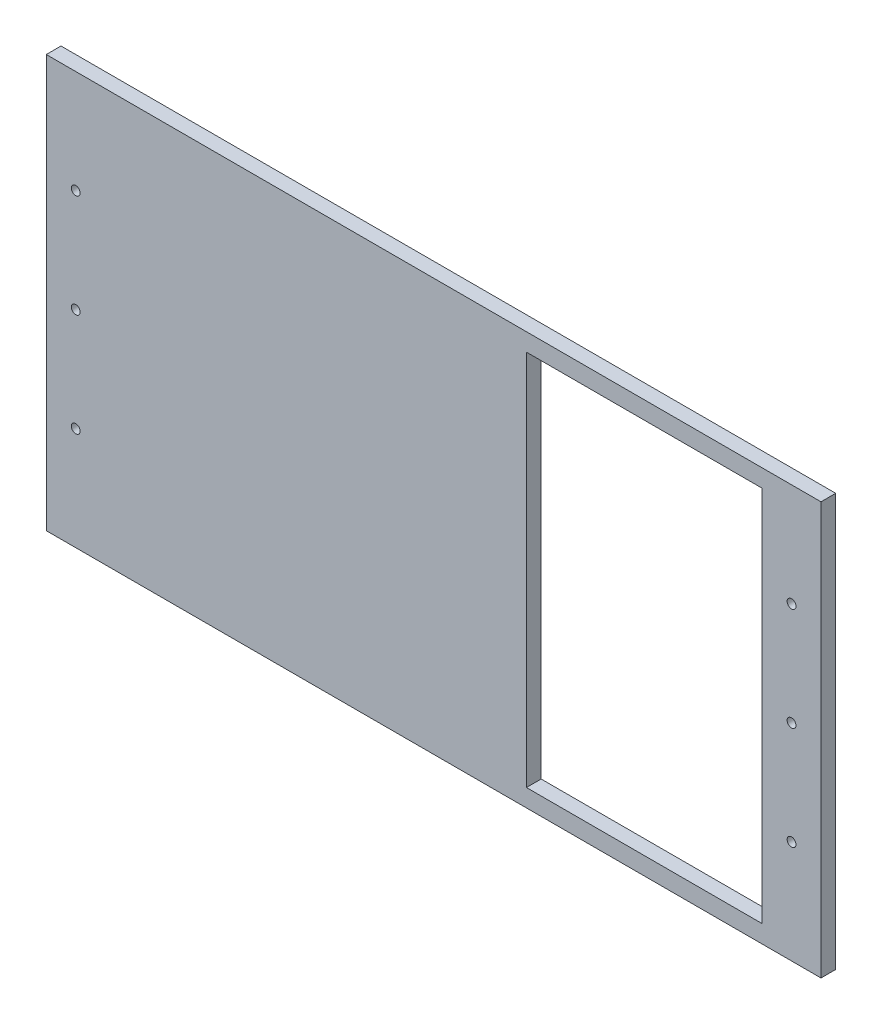
ISO-10303-21;
HEADER;
FILE_DESCRIPTION(('STEP AP214'),'2;1');
FILE_NAME('part.step','',(''),(''),'','','');
FILE_SCHEMA(('AUTOMOTIVE_DESIGN { 1 0 10303 214 1 1 1 1 }'));
ENDSEC;
DATA;
#1=APPLICATION_CONTEXT('core data for automotive mechanical design processes');
#2=APPLICATION_PROTOCOL_DEFINITION('international standard','automotive_design',2000,#1);
#3=PRODUCT_CONTEXT('',#1,'mechanical');
#4=PRODUCT('Part','Part','',(#3));
#5=PRODUCT_RELATED_PRODUCT_CATEGORY('part','',(#4));
#6=PRODUCT_DEFINITION_FORMATION('','',#4);
#7=PRODUCT_DEFINITION_CONTEXT('part definition',#1,'design');
#8=PRODUCT_DEFINITION('design','',#6,#7);
#9=PRODUCT_DEFINITION_SHAPE('','',#8);
#10=(LENGTH_UNIT() NAMED_UNIT(*) SI_UNIT(.MILLI.,.METRE.));
#11=(NAMED_UNIT(*) PLANE_ANGLE_UNIT() SI_UNIT($,.RADIAN.));
#12=(NAMED_UNIT(*) SI_UNIT($,.STERADIAN.) SOLID_ANGLE_UNIT());
#13=UNCERTAINTY_MEASURE_WITH_UNIT(LENGTH_MEASURE(1.E-05),#10,'distance_accuracy_value','');
#14=(GEOMETRIC_REPRESENTATION_CONTEXT(3) GLOBAL_UNCERTAINTY_ASSIGNED_CONTEXT((#13)) GLOBAL_UNIT_ASSIGNED_CONTEXT((#10,
#11,#12)) REPRESENTATION_CONTEXT('',''));
#15=CARTESIAN_POINT('',(0.,0.,0.));
#16=DIRECTION('',(0.,0.,1.));
#17=DIRECTION('',(1.,0.,0.));
#18=AXIS2_PLACEMENT_3D('',#15,#16,#17);
#19=CARTESIAN_POINT('',(0.,0.,5.));
#20=DIRECTION('',(0.,0.,-1.));
#21=DIRECTION('',(-1.,0.,0.));
#22=AXIS2_PLACEMENT_3D('',#19,#20,#21);
#23=PLANE('',#22);
#24=DIRECTION('',(0.,1.,0.));
#25=VECTOR('',#24,1.);
#26=CARTESIAN_POINT('',(131.5,-70.,5.));
#27=LINE('',#26,#25);
#28=CARTESIAN_POINT('',(131.5,-70.,5.));
#29=VERTEX_POINT('',#28);
#30=CARTESIAN_POINT('',(131.5,70.,5.));
#31=VERTEX_POINT('',#30);
#32=EDGE_CURVE('E156',#29,#31,#27,.T.);
#33=ORIENTED_EDGE('',*,*,#32,.T.);
#34=DIRECTION('',(-1.,0.,0.));
#35=VECTOR('',#34,1.);
#36=CARTESIAN_POINT('',(-131.5,70.,5.));
#37=LINE('',#36,#35);
#38=CARTESIAN_POINT('',(-131.5,70.,5.));
#39=VERTEX_POINT('',#38);
#40=EDGE_CURVE('E160',#31,#39,#37,.T.);
#41=ORIENTED_EDGE('',*,*,#40,.T.);
#42=DIRECTION('',(0.,-1.,0.));
#43=VECTOR('',#42,1.);
#44=CARTESIAN_POINT('',(-131.5,-70.,5.));
#45=LINE('',#44,#43);
#46=CARTESIAN_POINT('',(-131.5,-70.,5.));
#47=VERTEX_POINT('',#46);
#48=EDGE_CURVE('E164',#39,#47,#45,.T.);
#49=ORIENTED_EDGE('',*,*,#48,.T.);
#50=DIRECTION('',(1.,0.,0.));
#51=VECTOR('',#50,1.);
#52=CARTESIAN_POINT('',(-131.5,-70.,5.));
#53=LINE('',#52,#51);
#54=EDGE_CURVE('E167',#47,#29,#53,.T.);
#55=ORIENTED_EDGE('',*,*,#54,.T.);
#56=EDGE_LOOP('',(#33,#41,#49,#55));
#57=FACE_BOUND('',#56,.T.);
#58=DIRECTION('',(0.,-1.,0.));
#59=VECTOR('',#58,1.);
#60=CARTESIAN_POINT('',(31.5,64.,5.));
#61=LINE('',#60,#59);
#62=CARTESIAN_POINT('',(31.5,64.,5.));
#63=VERTEX_POINT('',#62);
#64=CARTESIAN_POINT('',(31.5,-64.,5.));
#65=VERTEX_POINT('',#64);
#66=EDGE_CURVE('E105',#63,#65,#61,.T.);
#67=ORIENTED_EDGE('',*,*,#66,.F.);
#68=DIRECTION('',(-1.,0.,0.));
#69=VECTOR('',#68,1.);
#70=CARTESIAN_POINT('',(31.5,64.,5.));
#71=LINE('',#70,#69);
#72=CARTESIAN_POINT('',(111.5,64.,5.));
#73=VERTEX_POINT('',#72);
#74=EDGE_CURVE('E132',#73,#63,#71,.T.);
#75=ORIENTED_EDGE('',*,*,#74,.F.);
#76=DIRECTION('',(0.,1.,0.));
#77=VECTOR('',#76,1.);
#78=CARTESIAN_POINT('',(111.5,64.,5.));
#79=LINE('',#78,#77);
#80=CARTESIAN_POINT('',(111.5,-64.,5.));
#81=VERTEX_POINT('',#80);
#82=EDGE_CURVE('E128',#81,#73,#79,.T.);
#83=ORIENTED_EDGE('',*,*,#82,.F.);
#84=DIRECTION('',(1.,0.,0.));
#85=VECTOR('',#84,1.);
#86=CARTESIAN_POINT('',(31.5,-64.,5.));
#87=LINE('',#86,#85);
#88=EDGE_CURVE('E114',#65,#81,#87,.T.);
#89=ORIENTED_EDGE('',*,*,#88,.F.);
#90=EDGE_LOOP('',(#67,#75,#83,#89));
#91=FACE_BOUND('',#90,.T.);
#92=CARTESIAN_POINT('',(-121.5,35.,5.));
#93=DIRECTION('',(0.,0.,1.));
#94=DIRECTION('',(1.,0.,0.));
#95=AXIS2_PLACEMENT_3D('',#92,#93,#94);
#96=CIRCLE('',#95,1.5);
#97=CARTESIAN_POINT('',(-120.,35.,5.));
#98=VERTEX_POINT('',#97);
#99=EDGE_CURVE('E140',#98,#98,#96,.T.);
#100=ORIENTED_EDGE('',*,*,#99,.F.);
#101=EDGE_LOOP('',(#100));
#102=FACE_BOUND('',#101,.T.);
#103=CARTESIAN_POINT('',(-121.5,0.,5.));
#104=DIRECTION('',(0.,0.,1.));
#105=DIRECTION('',(1.,0.,0.));
#106=AXIS2_PLACEMENT_3D('',#103,#104,#105);
#107=CIRCLE('',#106,1.5);
#108=CARTESIAN_POINT('',(-120.,0.,5.));
#109=VERTEX_POINT('',#108);
#110=EDGE_CURVE('E307',#109,#109,#107,.T.);
#111=ORIENTED_EDGE('',*,*,#110,.F.);
#112=EDGE_LOOP('',(#111));
#113=FACE_BOUND('',#112,.T.);
#114=CARTESIAN_POINT('',(-121.5,-35.,5.));
#115=DIRECTION('',(0.,0.,1.));
#116=DIRECTION('',(1.,0.,0.));
#117=AXIS2_PLACEMENT_3D('',#114,#115,#116);
#118=CIRCLE('',#117,1.5);
#119=CARTESIAN_POINT('',(-120.,-35.,5.));
#120=VERTEX_POINT('',#119);
#121=EDGE_CURVE('E299',#120,#120,#118,.T.);
#122=ORIENTED_EDGE('',*,*,#121,.F.);
#123=EDGE_LOOP('',(#122));
#124=FACE_BOUND('',#123,.T.);
#125=CARTESIAN_POINT('',(121.5,-35.,5.));
#126=DIRECTION('',(0.,0.,1.));
#127=DIRECTION('',(-1.,0.,0.));
#128=AXIS2_PLACEMENT_3D('',#125,#126,#127);
#129=CIRCLE('',#128,1.5);
#130=CARTESIAN_POINT('',(120.,-35.,5.));
#131=VERTEX_POINT('',#130);
#132=EDGE_CURVE('E291',#131,#131,#129,.T.);
#133=ORIENTED_EDGE('',*,*,#132,.F.);
#134=EDGE_LOOP('',(#133));
#135=FACE_BOUND('',#134,.T.);
#136=CARTESIAN_POINT('',(121.5,0.,5.));
#137=DIRECTION('',(0.,0.,1.));
#138=DIRECTION('',(-1.,0.,0.));
#139=AXIS2_PLACEMENT_3D('',#136,#137,#138);
#140=CIRCLE('',#139,1.5);
#141=CARTESIAN_POINT('',(120.,0.,5.));
#142=VERTEX_POINT('',#141);
#143=EDGE_CURVE('E283',#142,#142,#140,.T.);
#144=ORIENTED_EDGE('',*,*,#143,.F.);
#145=EDGE_LOOP('',(#144));
#146=FACE_BOUND('',#145,.T.);
#147=CARTESIAN_POINT('',(121.5,35.,5.));
#148=DIRECTION('',(0.,0.,1.));
#149=DIRECTION('',(-1.,0.,0.));
#150=AXIS2_PLACEMENT_3D('',#147,#148,#149);
#151=CIRCLE('',#150,1.5);
#152=CARTESIAN_POINT('',(120.,35.,5.));
#153=VERTEX_POINT('',#152);
#154=EDGE_CURVE('E272',#153,#153,#151,.T.);
#155=ORIENTED_EDGE('',*,*,#154,.F.);
#156=EDGE_LOOP('',(#155));
#157=FACE_BOUND('',#156,.T.);
#158=ADVANCED_FACE('F39',(#57,#91,#102,#113,#124,#135,#146,#157),#23,.F.);
#159=CARTESIAN_POINT('',(0.,0.,0.));
#160=DIRECTION('',(0.,0.,-1.));
#161=DIRECTION('',(-1.,0.,0.));
#162=AXIS2_PLACEMENT_3D('',#159,#160,#161);
#163=PLANE('',#162);
#164=CARTESIAN_POINT('',(121.5,0.,0.));
#165=DIRECTION('',(0.,0.,1.));
#166=DIRECTION('',(-1.,0.,0.));
#167=AXIS2_PLACEMENT_3D('',#164,#165,#166);
#168=CIRCLE('',#167,1.5);
#169=CARTESIAN_POINT('',(120.,0.,0.));
#170=VERTEX_POINT('',#169);
#171=EDGE_CURVE('E280',#170,#170,#168,.T.);
#172=ORIENTED_EDGE('',*,*,#171,.T.);
#173=EDGE_LOOP('',(#172));
#174=FACE_BOUND('',#173,.T.);
#175=CARTESIAN_POINT('',(-121.5,-35.,0.));
#176=DIRECTION('',(0.,0.,1.));
#177=DIRECTION('',(1.,0.,0.));
#178=AXIS2_PLACEMENT_3D('',#175,#176,#177);
#179=CIRCLE('',#178,1.5);
#180=CARTESIAN_POINT('',(-120.,-35.,0.));
#181=VERTEX_POINT('',#180);
#182=EDGE_CURVE('E295',#181,#181,#179,.T.);
#183=ORIENTED_EDGE('',*,*,#182,.T.);
#184=EDGE_LOOP('',(#183));
#185=FACE_BOUND('',#184,.T.);
#186=CARTESIAN_POINT('',(-121.5,35.,0.));
#187=DIRECTION('',(0.,0.,1.));
#188=DIRECTION('',(1.,0.,0.));
#189=AXIS2_PLACEMENT_3D('',#186,#187,#188);
#190=CIRCLE('',#189,1.5);
#191=CARTESIAN_POINT('',(-120.,35.,0.));
#192=VERTEX_POINT('',#191);
#193=EDGE_CURVE('E311',#192,#192,#190,.T.);
#194=ORIENTED_EDGE('',*,*,#193,.T.);
#195=EDGE_LOOP('',(#194));
#196=FACE_BOUND('',#195,.T.);
#197=DIRECTION('',(0.,1.,0.));
#198=VECTOR('',#197,1.);
#199=CARTESIAN_POINT('',(131.5,-70.,0.));
#200=LINE('',#199,#198);
#201=CARTESIAN_POINT('',(131.5,-70.,0.));
#202=VERTEX_POINT('',#201);
#203=CARTESIAN_POINT('',(131.5,70.,0.));
#204=VERTEX_POINT('',#203);
#205=EDGE_CURVE('E123',#202,#204,#200,.T.);
#206=ORIENTED_EDGE('',*,*,#205,.F.);
#207=DIRECTION('',(1.,0.,0.));
#208=VECTOR('',#207,1.);
#209=CARTESIAN_POINT('',(-131.5,-70.,0.));
#210=LINE('',#209,#208);
#211=CARTESIAN_POINT('',(-131.5,-70.,0.));
#212=VERTEX_POINT('',#211);
#213=EDGE_CURVE('E161',#212,#202,#210,.T.);
#214=ORIENTED_EDGE('',*,*,#213,.F.);
#215=DIRECTION('',(0.,-1.,0.));
#216=VECTOR('',#215,1.);
#217=CARTESIAN_POINT('',(-131.5,-70.,0.));
#218=LINE('',#217,#216);
#219=CARTESIAN_POINT('',(-131.5,70.,0.));
#220=VERTEX_POINT('',#219);
#221=EDGE_CURVE('E177',#220,#212,#218,.T.);
#222=ORIENTED_EDGE('',*,*,#221,.F.);
#223=DIRECTION('',(-1.,0.,0.));
#224=VECTOR('',#223,1.);
#225=CARTESIAN_POINT('',(-131.5,70.,0.));
#226=LINE('',#225,#224);
#227=EDGE_CURVE('E174',#204,#220,#226,.T.);
#228=ORIENTED_EDGE('',*,*,#227,.F.);
#229=EDGE_LOOP('',(#206,#214,#222,#228));
#230=FACE_BOUND('',#229,.T.);
#231=DIRECTION('',(-1.,0.,0.));
#232=VECTOR('',#231,1.);
#233=CARTESIAN_POINT('',(31.5,64.,0.));
#234=LINE('',#233,#232);
#235=CARTESIAN_POINT('',(111.5,64.,0.));
#236=VERTEX_POINT('',#235);
#237=CARTESIAN_POINT('',(31.5,64.,0.));
#238=VERTEX_POINT('',#237);
#239=EDGE_CURVE('E115',#236,#238,#234,.T.);
#240=ORIENTED_EDGE('',*,*,#239,.T.);
#241=DIRECTION('',(0.,-1.,0.));
#242=VECTOR('',#241,1.);
#243=CARTESIAN_POINT('',(31.5,64.,0.));
#244=LINE('',#243,#242);
#245=CARTESIAN_POINT('',(31.5,-64.,0.));
#246=VERTEX_POINT('',#245);
#247=EDGE_CURVE('E63',#238,#246,#244,.T.);
#248=ORIENTED_EDGE('',*,*,#247,.T.);
#249=DIRECTION('',(1.,0.,0.));
#250=VECTOR('',#249,1.);
#251=CARTESIAN_POINT('',(31.5,-64.,0.));
#252=LINE('',#251,#250);
#253=CARTESIAN_POINT('',(111.5,-64.,0.));
#254=VERTEX_POINT('',#253);
#255=EDGE_CURVE('E121',#246,#254,#252,.T.);
#256=ORIENTED_EDGE('',*,*,#255,.T.);
#257=DIRECTION('',(0.,1.,0.));
#258=VECTOR('',#257,1.);
#259=CARTESIAN_POINT('',(111.5,64.,0.));
#260=LINE('',#259,#258);
#261=EDGE_CURVE('E143',#254,#236,#260,.T.);
#262=ORIENTED_EDGE('',*,*,#261,.T.);
#263=EDGE_LOOP('',(#240,#248,#256,#262));
#264=FACE_BOUND('',#263,.T.);
#265=CARTESIAN_POINT('',(-121.5,0.,0.));
#266=DIRECTION('',(0.,0.,1.));
#267=DIRECTION('',(1.,0.,0.));
#268=AXIS2_PLACEMENT_3D('',#265,#266,#267);
#269=CIRCLE('',#268,1.5);
#270=CARTESIAN_POINT('',(-120.,0.,0.));
#271=VERTEX_POINT('',#270);
#272=EDGE_CURVE('E303',#271,#271,#269,.T.);
#273=ORIENTED_EDGE('',*,*,#272,.T.);
#274=EDGE_LOOP('',(#273));
#275=FACE_BOUND('',#274,.T.);
#276=CARTESIAN_POINT('',(121.5,-35.,0.));
#277=DIRECTION('',(0.,0.,1.));
#278=DIRECTION('',(-1.,0.,0.));
#279=AXIS2_PLACEMENT_3D('',#276,#277,#278);
#280=CIRCLE('',#279,1.5);
#281=CARTESIAN_POINT('',(120.,-35.,0.));
#282=VERTEX_POINT('',#281);
#283=EDGE_CURVE('E287',#282,#282,#280,.T.);
#284=ORIENTED_EDGE('',*,*,#283,.T.);
#285=EDGE_LOOP('',(#284));
#286=FACE_BOUND('',#285,.T.);
#287=CARTESIAN_POINT('',(121.5,35.,0.));
#288=DIRECTION('',(0.,0.,1.));
#289=DIRECTION('',(-1.,0.,0.));
#290=AXIS2_PLACEMENT_3D('',#287,#288,#289);
#291=CIRCLE('',#290,1.5);
#292=CARTESIAN_POINT('',(120.,35.,0.));
#293=VERTEX_POINT('',#292);
#294=EDGE_CURVE('E275',#293,#293,#291,.T.);
#295=ORIENTED_EDGE('',*,*,#294,.T.);
#296=EDGE_LOOP('',(#295));
#297=FACE_BOUND('',#296,.T.);
#298=ADVANCED_FACE('F200',(#174,#185,#196,#230,#264,#275,#286,#297),#163,.T.);
#299=CARTESIAN_POINT('',(131.5,-70.,5.));
#300=DIRECTION('',(-1.,0.,0.));
#301=DIRECTION('',(0.,0.,1.));
#302=AXIS2_PLACEMENT_3D('',#299,#300,#301);
#303=PLANE('',#302);
#304=ORIENTED_EDGE('',*,*,#205,.T.);
#305=DIRECTION('',(0.,0.,-1.));
#306=VECTOR('',#305,1.);
#307=CARTESIAN_POINT('',(131.5,70.,5.));
#308=LINE('',#307,#306);
#309=EDGE_CURVE('E11',#31,#204,#308,.T.);
#310=ORIENTED_EDGE('',*,*,#309,.F.);
#311=ORIENTED_EDGE('',*,*,#32,.F.);
#312=DIRECTION('',(0.,0.,-1.));
#313=VECTOR('',#312,1.);
#314=CARTESIAN_POINT('',(131.5,-70.,5.));
#315=LINE('',#314,#313);
#316=EDGE_CURVE('E170',#29,#202,#315,.T.);
#317=ORIENTED_EDGE('',*,*,#316,.T.);
#318=EDGE_LOOP('',(#304,#310,#311,#317));
#319=FACE_BOUND('',#318,.T.);
#320=ADVANCED_FACE('F41',(#319),#303,.F.);
#321=CARTESIAN_POINT('',(-131.5,70.,5.));
#322=DIRECTION('',(0.,-1.,0.));
#323=DIRECTION('',(0.,0.,-1.));
#324=AXIS2_PLACEMENT_3D('',#321,#322,#323);
#325=PLANE('',#324);
#326=ORIENTED_EDGE('',*,*,#227,.T.);
#327=DIRECTION('',(0.,0.,-1.));
#328=VECTOR('',#327,1.);
#329=CARTESIAN_POINT('',(-131.5,70.,5.));
#330=LINE('',#329,#328);
#331=EDGE_CURVE('E48',#39,#220,#330,.T.);
#332=ORIENTED_EDGE('',*,*,#331,.F.);
#333=ORIENTED_EDGE('',*,*,#40,.F.);
#334=ORIENTED_EDGE('',*,*,#309,.T.);
#335=EDGE_LOOP('',(#326,#332,#333,#334));
#336=FACE_BOUND('',#335,.T.);
#337=ADVANCED_FACE('F210',(#336),#325,.F.);
#338=CARTESIAN_POINT('',(-131.5,-70.,5.));
#339=DIRECTION('',(1.,0.,0.));
#340=DIRECTION('',(0.,0.,-1.));
#341=AXIS2_PLACEMENT_3D('',#338,#339,#340);
#342=PLANE('',#341);
#343=ORIENTED_EDGE('',*,*,#221,.T.);
#344=DIRECTION('',(0.,0.,-1.));
#345=VECTOR('',#344,1.);
#346=CARTESIAN_POINT('',(-131.5,-70.,5.));
#347=LINE('',#346,#345);
#348=EDGE_CURVE('E185',#47,#212,#347,.T.);
#349=ORIENTED_EDGE('',*,*,#348,.F.);
#350=ORIENTED_EDGE('',*,*,#48,.F.);
#351=ORIENTED_EDGE('',*,*,#331,.T.);
#352=EDGE_LOOP('',(#343,#349,#350,#351));
#353=FACE_BOUND('',#352,.T.);
#354=ADVANCED_FACE('F194',(#353),#342,.F.);
#355=CARTESIAN_POINT('',(-131.5,-70.,5.));
#356=DIRECTION('',(0.,1.,0.));
#357=DIRECTION('',(0.,0.,1.));
#358=AXIS2_PLACEMENT_3D('',#355,#356,#357);
#359=PLANE('',#358);
#360=ORIENTED_EDGE('',*,*,#213,.T.);
#361=ORIENTED_EDGE('',*,*,#316,.F.);
#362=ORIENTED_EDGE('',*,*,#54,.F.);
#363=ORIENTED_EDGE('',*,*,#348,.T.);
#364=EDGE_LOOP('',(#360,#361,#362,#363));
#365=FACE_BOUND('',#364,.T.);
#366=ADVANCED_FACE('F204',(#365),#359,.F.);
#367=CARTESIAN_POINT('',(31.5,64.,5.));
#368=DIRECTION('',(1.,0.,0.));
#369=DIRECTION('',(0.,1.,0.));
#370=AXIS2_PLACEMENT_3D('',#367,#368,#369);
#371=PLANE('',#370);
#372=ORIENTED_EDGE('',*,*,#247,.F.);
#373=DIRECTION('',(0.,0.,-1.));
#374=VECTOR('',#373,1.);
#375=CARTESIAN_POINT('',(31.5,64.,5.));
#376=LINE('',#375,#374);
#377=EDGE_CURVE('E109',#63,#238,#376,.T.);
#378=ORIENTED_EDGE('',*,*,#377,.F.);
#379=ORIENTED_EDGE('',*,*,#66,.T.);
#380=DIRECTION('',(0.,0.,-1.));
#381=VECTOR('',#380,1.);
#382=CARTESIAN_POINT('',(31.5,-64.,5.));
#383=LINE('',#382,#381);
#384=EDGE_CURVE('E108',#65,#246,#383,.T.);
#385=ORIENTED_EDGE('',*,*,#384,.T.);
#386=EDGE_LOOP('',(#372,#378,#379,#385));
#387=FACE_BOUND('',#386,.T.);
#388=ADVANCED_FACE('F107',(#387),#371,.T.);
#389=CARTESIAN_POINT('',(31.5,-64.,5.));
#390=DIRECTION('',(0.,1.,0.));
#391=DIRECTION('',(0.,0.,1.));
#392=AXIS2_PLACEMENT_3D('',#389,#390,#391);
#393=PLANE('',#392);
#394=ORIENTED_EDGE('',*,*,#255,.F.);
#395=ORIENTED_EDGE('',*,*,#384,.F.);
#396=ORIENTED_EDGE('',*,*,#88,.T.);
#397=DIRECTION('',(0.,0.,-1.));
#398=VECTOR('',#397,1.);
#399=CARTESIAN_POINT('',(111.5,-64.,5.));
#400=LINE('',#399,#398);
#401=EDGE_CURVE('E124',#81,#254,#400,.T.);
#402=ORIENTED_EDGE('',*,*,#401,.T.);
#403=EDGE_LOOP('',(#394,#395,#396,#402));
#404=FACE_BOUND('',#403,.T.);
#405=ADVANCED_FACE('F118',(#404),#393,.T.);
#406=CARTESIAN_POINT('',(111.5,64.,5.));
#407=DIRECTION('',(-1.,0.,0.));
#408=DIRECTION('',(0.,-1.,0.));
#409=AXIS2_PLACEMENT_3D('',#406,#407,#408);
#410=PLANE('',#409);
#411=ORIENTED_EDGE('',*,*,#261,.F.);
#412=ORIENTED_EDGE('',*,*,#401,.F.);
#413=ORIENTED_EDGE('',*,*,#82,.T.);
#414=DIRECTION('',(0.,0.,-1.));
#415=VECTOR('',#414,1.);
#416=CARTESIAN_POINT('',(111.5,64.,5.));
#417=LINE('',#416,#415);
#418=EDGE_CURVE('E55',#73,#236,#417,.T.);
#419=ORIENTED_EDGE('',*,*,#418,.T.);
#420=EDGE_LOOP('',(#411,#412,#413,#419));
#421=FACE_BOUND('',#420,.T.);
#422=ADVANCED_FACE('F234',(#421),#410,.T.);
#423=CARTESIAN_POINT('',(31.5,64.,5.));
#424=DIRECTION('',(0.,-1.,0.));
#425=DIRECTION('',(0.,0.,-1.));
#426=AXIS2_PLACEMENT_3D('',#423,#424,#425);
#427=PLANE('',#426);
#428=ORIENTED_EDGE('',*,*,#239,.F.);
#429=ORIENTED_EDGE('',*,*,#418,.F.);
#430=ORIENTED_EDGE('',*,*,#74,.T.);
#431=ORIENTED_EDGE('',*,*,#377,.T.);
#432=EDGE_LOOP('',(#428,#429,#430,#431));
#433=FACE_BOUND('',#432,.T.);
#434=ADVANCED_FACE('F238',(#433),#427,.T.);
#435=CARTESIAN_POINT('',(-121.5,35.,5.));
#436=DIRECTION('',(0.,0.,-1.));
#437=DIRECTION('',(-1.,0.,0.));
#438=AXIS2_PLACEMENT_3D('',#435,#436,#437);
#439=CYLINDRICAL_SURFACE('',#438,1.5);
#440=ORIENTED_EDGE('',*,*,#99,.T.);
#441=EDGE_LOOP('',(#440));
#442=FACE_BOUND('',#441,.T.);
#443=ORIENTED_EDGE('',*,*,#193,.F.);
#444=EDGE_LOOP('',(#443));
#445=FACE_BOUND('',#444,.T.);
#446=ADVANCED_FACE('F244',(#442,#445),#439,.F.);
#447=CARTESIAN_POINT('',(-121.5,0.,5.));
#448=DIRECTION('',(0.,0.,-1.));
#449=DIRECTION('',(-1.,0.,0.));
#450=AXIS2_PLACEMENT_3D('',#447,#448,#449);
#451=CYLINDRICAL_SURFACE('',#450,1.5);
#452=ORIENTED_EDGE('',*,*,#110,.T.);
#453=EDGE_LOOP('',(#452));
#454=FACE_BOUND('',#453,.T.);
#455=ORIENTED_EDGE('',*,*,#272,.F.);
#456=EDGE_LOOP('',(#455));
#457=FACE_BOUND('',#456,.T.);
#458=ADVANCED_FACE('F247',(#454,#457),#451,.F.);
#459=CARTESIAN_POINT('',(-121.5,-35.,5.));
#460=DIRECTION('',(0.,0.,-1.));
#461=DIRECTION('',(-1.,0.,0.));
#462=AXIS2_PLACEMENT_3D('',#459,#460,#461);
#463=CYLINDRICAL_SURFACE('',#462,1.5);
#464=ORIENTED_EDGE('',*,*,#121,.T.);
#465=EDGE_LOOP('',(#464));
#466=FACE_BOUND('',#465,.T.);
#467=ORIENTED_EDGE('',*,*,#182,.F.);
#468=EDGE_LOOP('',(#467));
#469=FACE_BOUND('',#468,.T.);
#470=ADVANCED_FACE('F251',(#466,#469),#463,.F.);
#471=CARTESIAN_POINT('',(121.5,-35.,5.));
#472=DIRECTION('',(0.,0.,-1.));
#473=DIRECTION('',(-1.,0.,0.));
#474=AXIS2_PLACEMENT_3D('',#471,#472,#473);
#475=CYLINDRICAL_SURFACE('',#474,1.5);
#476=ORIENTED_EDGE('',*,*,#132,.T.);
#477=EDGE_LOOP('',(#476));
#478=FACE_BOUND('',#477,.T.);
#479=ORIENTED_EDGE('',*,*,#283,.F.);
#480=EDGE_LOOP('',(#479));
#481=FACE_BOUND('',#480,.T.);
#482=ADVANCED_FACE('F255',(#478,#481),#475,.F.);
#483=CARTESIAN_POINT('',(121.5,0.,5.));
#484=DIRECTION('',(0.,0.,-1.));
#485=DIRECTION('',(-1.,0.,0.));
#486=AXIS2_PLACEMENT_3D('',#483,#484,#485);
#487=CYLINDRICAL_SURFACE('',#486,1.5);
#488=ORIENTED_EDGE('',*,*,#143,.T.);
#489=EDGE_LOOP('',(#488));
#490=FACE_BOUND('',#489,.T.);
#491=ORIENTED_EDGE('',*,*,#171,.F.);
#492=EDGE_LOOP('',(#491));
#493=FACE_BOUND('',#492,.T.);
#494=ADVANCED_FACE('F259',(#490,#493),#487,.F.);
#495=CARTESIAN_POINT('',(121.5,35.,5.));
#496=DIRECTION('',(0.,0.,-1.));
#497=DIRECTION('',(-1.,0.,0.));
#498=AXIS2_PLACEMENT_3D('',#495,#496,#497);
#499=CYLINDRICAL_SURFACE('',#498,1.5);
#500=ORIENTED_EDGE('',*,*,#154,.T.);
#501=EDGE_LOOP('',(#500));
#502=FACE_BOUND('',#501,.T.);
#503=ORIENTED_EDGE('',*,*,#294,.F.);
#504=EDGE_LOOP('',(#503));
#505=FACE_BOUND('',#504,.T.);
#506=ADVANCED_FACE('F263',(#502,#505),#499,.F.);
#507=CLOSED_SHELL('',(#158,#298,#320,#337,#354,#366,#388,#405,#422,#434,#446,#458,#470,#482,
#494,#506));
#508=MANIFOLD_SOLID_BREP('B2',#507);
#509=ADVANCED_BREP_SHAPE_REPRESENTATION('',(#18,#508),#14);
#510=SHAPE_DEFINITION_REPRESENTATION(#9,#509);
ENDSEC;
END-ISO-10303-21;
